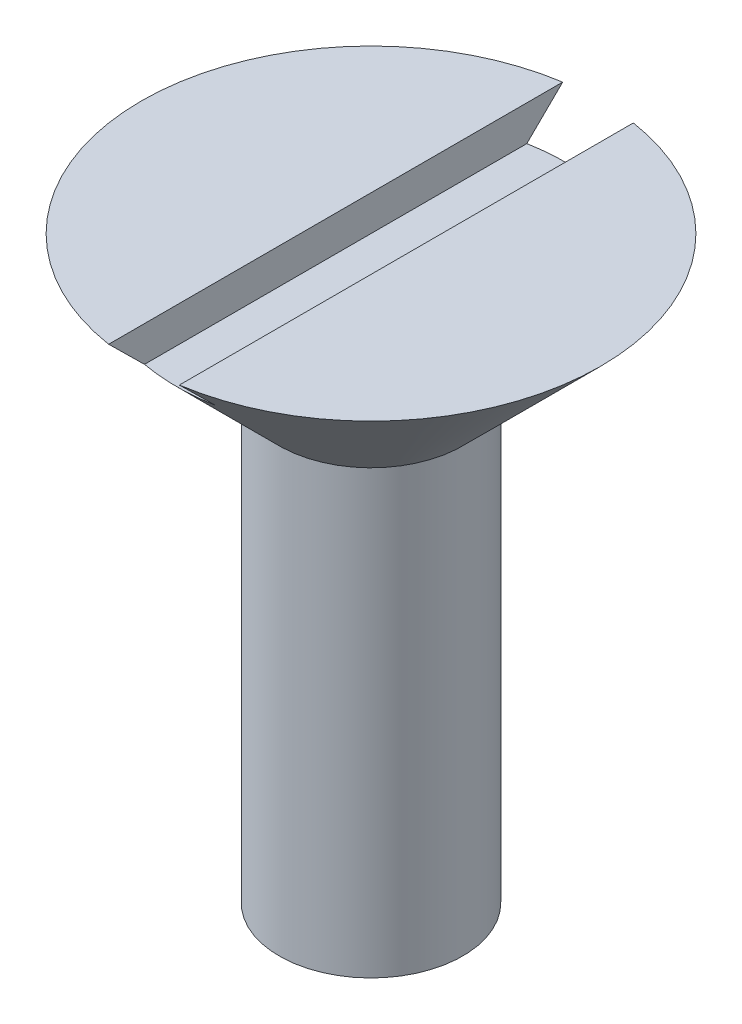
ISO-10303-21;
HEADER;
FILE_DESCRIPTION(('STEP AP214'),'2;1');
FILE_NAME('part.step','',(''),(''),'','','');
FILE_SCHEMA(('AUTOMOTIVE_DESIGN { 1 0 10303 214 1 1 1 1 }'));
ENDSEC;
DATA;
#1=APPLICATION_CONTEXT('core data for automotive mechanical design processes');
#2=APPLICATION_PROTOCOL_DEFINITION('international standard','automotive_design',2000,#1);
#3=PRODUCT_CONTEXT('',#1,'mechanical');
#4=PRODUCT('Part','Part','',(#3));
#5=PRODUCT_RELATED_PRODUCT_CATEGORY('part','',(#4));
#6=PRODUCT_DEFINITION_FORMATION('','',#4);
#7=PRODUCT_DEFINITION_CONTEXT('part definition',#1,'design');
#8=PRODUCT_DEFINITION('design','',#6,#7);
#9=PRODUCT_DEFINITION_SHAPE('','',#8);
#10=(LENGTH_UNIT() NAMED_UNIT(*) SI_UNIT(.MILLI.,.METRE.));
#11=(NAMED_UNIT(*) PLANE_ANGLE_UNIT() SI_UNIT($,.RADIAN.));
#12=(NAMED_UNIT(*) SI_UNIT($,.STERADIAN.) SOLID_ANGLE_UNIT());
#13=UNCERTAINTY_MEASURE_WITH_UNIT(LENGTH_MEASURE(1.E-05),#10,'distance_accuracy_value','');
#14=(GEOMETRIC_REPRESENTATION_CONTEXT(3) GLOBAL_UNCERTAINTY_ASSIGNED_CONTEXT((#13)) GLOBAL_UNIT_ASSIGNED_CONTEXT((#10,
#11,#12)) REPRESENTATION_CONTEXT('',''));
#15=CARTESIAN_POINT('',(0.,0.,0.));
#16=DIRECTION('',(0.,0.,1.));
#17=DIRECTION('',(1.,0.,0.));
#18=AXIS2_PLACEMENT_3D('',#15,#16,#17);
#19=CARTESIAN_POINT('',(0.,49.5556273934167,0.));
#20=DIRECTION('',(0.,-1.,0.));
#21=DIRECTION('',(1.,0.,0.));
#22=AXIS2_PLACEMENT_3D('',#19,#20,#21);
#23=PLANE('',#22);
#24=CARTESIAN_POINT('',(0.,49.5556273934167,0.));
#25=DIRECTION('',(0.,1.,0.));
#26=DIRECTION('',(-1.,0.,0.));
#27=AXIS2_PLACEMENT_3D('',#24,#25,#26);
#28=CIRCLE('',#27,6.5);
#29=CARTESIAN_POINT('',(1.,49.5556273934167,6.42261628933256));
#30=VERTEX_POINT('',#29);
#31=CARTESIAN_POINT('',(1.,49.5556273934167,-6.42261628933256));
#32=VERTEX_POINT('',#31);
#33=EDGE_CURVE('E137',#30,#32,#28,.T.);
#34=ORIENTED_EDGE('',*,*,#33,.T.);
#35=DIRECTION('',(0.,0.,1.));
#36=VECTOR('',#35,1.);
#37=CARTESIAN_POINT('',(1.,49.5556273934167,0.));
#38=LINE('',#37,#36);
#39=EDGE_CURVE('E138',#32,#30,#38,.T.);
#40=ORIENTED_EDGE('',*,*,#39,.T.);
#41=EDGE_LOOP('',(#34,#40));
#42=FACE_BOUND('',#41,.T.);
#43=ADVANCED_FACE('F36',(#42),#23,.F.);
#44=CARTESIAN_POINT('',(0.,31.6530138632886,0.));
#45=DIRECTION('',(0.,1.,0.));
#46=DIRECTION('',(-1.,0.,0.));
#47=AXIS2_PLACEMENT_3D('',#44,#45,#46);
#48=CONICAL_SURFACE('',#47,0.,1.0471975511966);
#49=CARTESIAN_POINT('',(0.,33.1520716589028,0.));
#50=DIRECTION('',(0.,1.,0.));
#51=DIRECTION('',(-1.,0.,0.));
#52=AXIS2_PLACEMENT_3D('',#49,#50,#51);
#53=CIRCLE('',#52,2.59644426548604);
#54=CARTESIAN_POINT('',(-2.59644426548604,33.1520716589028,0.));
#55=VERTEX_POINT('',#54);
#56=EDGE_CURVE('E142',#55,#55,#53,.T.);
#57=ORIENTED_EDGE('',*,*,#56,.F.);
#58=EDGE_LOOP('',(#57));
#59=FACE_BOUND('',#58,.T.);
#60=CARTESIAN_POINT('',(0.,31.6530138632886,0.));
#61=VERTEX_POINT('',#60);
#62=VERTEX_LOOP('',#61);
#63=FACE_BOUND('',#62,.T.);
#64=ADVANCED_FACE('F38',(#59,#63),#48,.T.);
#65=CARTESIAN_POINT('',(0.,49.5556273934167,0.));
#66=DIRECTION('',(0.,1.,0.));
#67=DIRECTION('',(-1.,0.,0.));
#68=AXIS2_PLACEMENT_3D('',#65,#66,#67);
#69=CYLINDRICAL_SURFACE('',#68,2.59644426548604);
#70=CARTESIAN_POINT('',(0.,45.6520716589028,0.));
#71=DIRECTION('',(0.,1.,0.));
#72=DIRECTION('',(-1.,0.,0.));
#73=AXIS2_PLACEMENT_3D('',#70,#71,#72);
#74=CIRCLE('',#73,2.59644426548604);
#75=CARTESIAN_POINT('',(-2.59644426548604,45.6520716589028,0.));
#76=VERTEX_POINT('',#75);
#77=EDGE_CURVE('E140',#76,#76,#74,.T.);
#78=ORIENTED_EDGE('',*,*,#77,.F.);
#79=EDGE_LOOP('',(#78));
#80=FACE_BOUND('',#79,.T.);
#81=ORIENTED_EDGE('',*,*,#56,.T.);
#82=EDGE_LOOP('',(#81));
#83=FACE_BOUND('',#82,.T.);
#84=ADVANCED_FACE('F127',(#80,#83),#69,.T.);
#85=CARTESIAN_POINT('',(0.,45.6520716589028,0.));
#86=DIRECTION('',(0.,1.,0.));
#87=DIRECTION('',(-1.,0.,0.));
#88=AXIS2_PLACEMENT_3D('',#85,#86,#87);
#89=CONICAL_SURFACE('',#88,2.59644426548604,0.785398163397453);
#90=CARTESIAN_POINT('',(0.,48.5556273934167,0.));
#91=DIRECTION('',(0.,-1.,0.));
#92=DIRECTION('',(0.,0.,-1.));
#93=AXIS2_PLACEMENT_3D('',#90,#91,#92);
#94=CIRCLE('',#93,5.49999999999999);
#95=CARTESIAN_POINT('',(-0.999999999999998,48.5556273934167,-5.40832691319597));
#96=VERTEX_POINT('',#95);
#97=CARTESIAN_POINT('',(1.,48.5556273934167,-5.40832691319597));
#98=VERTEX_POINT('',#97);
#99=EDGE_CURVE('E11',#96,#98,#94,.T.);
#100=ORIENTED_EDGE('',*,*,#99,.T.);
#101=CARTESIAN_POINT('',(1.,49.5563273934167,6.42332472244709));
#102=CARTESIAN_POINT('',(1.,49.3718349006858,6.23660097945427));
#103=CARTESIAN_POINT('',(1.,49.1874301279146,6.04979042026791));
#104=CARTESIAN_POINT('',(1.,48.8187600631537,5.67580075194413));
#105=CARTESIAN_POINT('',(1.,48.6344949310945,5.48862148517339));
#106=CARTESIAN_POINT('',(1.,48.2641485086885,5.11174427199786));
#107=CARTESIAN_POINT('',(1.,48.0780711564097,4.92204245247591));
#108=CARTESIAN_POINT('',(1.,47.7065189230305,4.54228085926044));
#109=CARTESIAN_POINT('',(1.,47.5210437391687,4.35222138163066));
#110=CARTESIAN_POINT('',(1.,47.0759531665542,3.89448779308009));
#111=CARTESIAN_POINT('',(1.,46.8166694616344,3.62648996292628));
#112=CARTESIAN_POINT('',(1.,46.4293715104418,3.22235847326324));
#113=CARTESIAN_POINT('',(1.,46.3004018235296,3.08714155543481));
#114=CARTESIAN_POINT('',(1.,46.0434438871884,2.81583986260065));
#115=CARTESIAN_POINT('',(1.,45.9154554067091,2.67975530664799));
#116=CARTESIAN_POINT('',(1.,45.6620840688314,2.40750996464741));
#117=CARTESIAN_POINT('',(1.,45.5366880652963,2.27136147506032));
#118=CARTESIAN_POINT('',(1.,45.3502788400979,2.06549251852141));
#119=CARTESIAN_POINT('',(1.,45.2883941698288,1.99656195550246));
#120=CARTESIAN_POINT('',(1.,45.1654067461725,1.85800765522076));
#121=CARTESIAN_POINT('',(1.,45.1043039763926,1.78838393254484));
#122=CARTESIAN_POINT('',(1.,44.983402415004,1.64849944827689));
#123=CARTESIAN_POINT('',(1.,44.9235993684596,1.57824237330104));
#124=CARTESIAN_POINT('',(1.,44.8054778779732,1.43649465507042));
#125=CARTESIAN_POINT('',(1.,44.7471592916823,1.36500413120581));
#126=CARTESIAN_POINT('',(1.,44.6327842460895,1.22040224759312));
#127=CARTESIAN_POINT('',(1.,44.5767245586803,1.14729345020522));
#128=CARTESIAN_POINT('',(1.,44.4679587963823,0.998633654183092));
#129=CARTESIAN_POINT('',(1.,44.4152506931825,0.923084175167167));
#130=CARTESIAN_POINT('',(1.,44.3530410849349,0.826733268002377));
#131=CARTESIAN_POINT('',(1.,44.3409336736924,0.807613449628497));
#132=CARTESIAN_POINT('',(1.,44.3171073241212,0.769130032509396));
#133=CARTESIAN_POINT('',(1.,44.3053884360386,0.749766402676427));
#134=CARTESIAN_POINT('',(1.,44.270893262789,0.69127744385543));
#135=CARTESIAN_POINT('',(1.,44.248779752349,0.651756012110399));
#136=CARTESIAN_POINT('',(1.,44.2070600808765,0.571795836460213));
#137=CARTESIAN_POINT('',(1.,44.1874353422073,0.531366913059411));
#138=CARTESIAN_POINT('',(1.,44.1512488811089,0.449164527118057));
#139=CARTESIAN_POINT('',(1.,44.1346862302821,0.407391476629304));
#140=CARTESIAN_POINT('',(1.,44.1001533055177,0.306630339616176));
#141=CARTESIAN_POINT('',(1.,44.0839417200509,0.247006700383582));
#142=CARTESIAN_POINT('',(1.,44.0617986819237,0.125997310764446));
#143=CARTESIAN_POINT('',(1.,44.0558295565245,0.0646188656950215));
#144=CARTESIAN_POINT('',(1.,44.0554348747838,-0.0584045004398524));
#145=CARTESIAN_POINT('',(1.,44.0610514812623,-0.1200495772222));
#146=CARTESIAN_POINT('',(1.,44.0826368877384,-0.241594604406597));
#147=CARTESIAN_POINT('',(1.,44.0986408856868,-0.301487895031297));
#148=CARTESIAN_POINT('',(1.,44.1398728373406,-0.42325524859561));
#149=CARTESIAN_POINT('',(1.,44.1657360141788,-0.4849047615989));
#150=CARTESIAN_POINT('',(1.,44.22340682896,-0.605404375291109));
#151=CARTESIAN_POINT('',(1.,44.2552258620696,-0.664248833759941));
#152=CARTESIAN_POINT('',(1.,44.3230263337406,-0.780076722377074));
#153=CARTESIAN_POINT('',(1.,44.3590387558889,-0.837041711978607));
#154=CARTESIAN_POINT('',(1.,44.4150425992618,-0.92110865579865));
#155=CARTESIAN_POINT('',(1.,44.4340329861368,-0.948889451470567));
#156=CARTESIAN_POINT('',(1.,44.4725756988928,-1.00405791508456));
#157=CARTESIAN_POINT('',(1.,44.4921280085565,-1.03144559433807));
#158=CARTESIAN_POINT('',(1.,44.5551503567173,-1.11814350022169));
#159=CARTESIAN_POINT('',(1.,44.5995003816039,-1.17681365371054));
#160=CARTESIAN_POINT('',(1.,44.6897590246513,-1.2929461238686));
#161=CARTESIAN_POINT('',(1.,44.7356678835745,-1.35040825171832));
#162=CARTESIAN_POINT('',(1.,44.8751043376926,-1.52148386035262));
#163=CARTESIAN_POINT('',(1.,44.9703015644438,-1.63373305297759));
#164=CARTESIAN_POINT('',(1.,45.1633672636201,-1.85622604953626));
#165=CARTESIAN_POINT('',(1.,45.2612401172959,-1.96646600221256));
#166=CARTESIAN_POINT('',(1.,45.4585529588412,-2.18547633450576));
#167=CARTESIAN_POINT('',(1.,45.5579925005781,-2.29424711666669));
#168=CARTESIAN_POINT('',(1.,45.7575958934933,-2.51044729255318));
#169=CARTESIAN_POINT('',(1.,45.8577562199349,-2.61787995144487));
#170=CARTESIAN_POINT('',(1.,46.0588245132372,-2.83205668510773));
#171=CARTESIAN_POINT('',(1.,46.1597325319362,-2.93880071115716));
#172=CARTESIAN_POINT('',(1.,46.4630583377278,-3.25807348248428));
#173=CARTESIAN_POINT('',(1.,46.66626903229,-3.46984818145713));
#174=CARTESIAN_POINT('',(1.,47.0921786136603,-3.91117980862672));
#175=CARTESIAN_POINT('',(1.,47.3149902938673,-4.14062755160511));
#176=CARTESIAN_POINT('',(1.,47.7615623205888,-4.59874114188874));
#177=CARTESIAN_POINT('',(1.,47.9853229488197,-4.82740671438633));
#178=CARTESIAN_POINT('',(1.,48.4334388693308,-5.28420548161052));
#179=CARTESIAN_POINT('',(1.,48.6577942269807,-5.51233861215162));
#180=CARTESIAN_POINT('',(1.,49.1068353170085,-5.96812929258627));
#181=CARTESIAN_POINT('',(1.,49.3315209138295,-6.19578697599766));
#182=CARTESIAN_POINT('',(1.,49.5563273934167,-6.42332472244709));
#183=B_SPLINE_CURVE_WITH_KNOTS('',3,(#101,#102,#103,#104,#105,#106,#107,#108,#109,#110,#111,
#112,#113,#114,#115,#116,#117,#118,#119,#120,#121,#122,#123,#124,#125,#126,#127,#128,#129,#130,
#131,#132,#133,#134,#135,#136,#137,#138,#139,#140,#141,#142,#143,#144,#145,#146,#147,#148,#149,
#150,#151,#152,#153,#154,#155,#156,#157,#158,#159,#160,#161,#162,#163,#164,#165,#166,#167,#168,
#169,#170,#171,#172,#173,#174,#175,#176,#177,#178,#179,#180,#181,#182),.UNSPECIFIED.,.F.,.F.,(4,
2,2,2,2,2,2,2,2,2,2,2,2,2,2,2,2,2,2,2,2,2,2,2,2,2,2,2,2,2,2,2,2,2,2,2,2,2,2,2,4),(0.,
0.787482879091102,1.57545946982075,2.37264371237522,3.16933207457068,4.28800672997836,
4.84858456810999,5.40902607813937,5.96429483881583,6.24219393443101,6.52008719426129,
6.79686319025391,7.07361254470393,7.3499512636095,7.62612112424389,7.69400967717522,
7.76190697586417,7.89770861286129,8.0324279907232,8.16710645565276,8.35176568840783,
8.53574425942201,8.72039354672398,8.90567181282051,9.1057648961966,9.30624479924503,
9.50831322811276,9.60926230610502,9.71020847356947,9.930805917818,10.1514375897978,
10.5929016423222,11.0351379005565,11.4772504248661,11.9178874921873,12.3585554006098,
13.2390498022864,14.1985373102663,15.1583329960949,16.1182389566304,17.077823941592),.UNSPECIFIED.);
#184=EDGE_CURVE('E94',#98,#32,#183,.T.);
#185=ORIENTED_EDGE('',*,*,#184,.T.);
#186=ORIENTED_EDGE('',*,*,#33,.F.);
#187=CARTESIAN_POINT('',(1.,48.5556273934167,5.40832691319597));
#188=VERTEX_POINT('',#187);
#189=EDGE_CURVE('E96',#30,#188,#183,.T.);
#190=ORIENTED_EDGE('',*,*,#189,.T.);
#191=CARTESIAN_POINT('',(-0.999999999999998,48.5556273934167,5.40832691319597));
#192=VERTEX_POINT('',#191);
#193=EDGE_CURVE('E40',#188,#192,#94,.T.);
#194=ORIENTED_EDGE('',*,*,#193,.T.);
#195=CARTESIAN_POINT('',(-0.999999999999999,49.5563273934167,-6.42332472244709));
#196=CARTESIAN_POINT('',(-0.999999999999998,49.3718349006858,-6.23660097945426));
#197=CARTESIAN_POINT('',(-0.999999999999998,49.1874301279146,-6.0497904202679));
#198=CARTESIAN_POINT('',(-0.999999999999998,48.8187600631537,-5.67580075194413));
#199=CARTESIAN_POINT('',(-0.999999999999998,48.6344949310945,-5.48862148517338));
#200=CARTESIAN_POINT('',(-0.999999999999998,48.2641485086885,-5.11174427199785));
#201=CARTESIAN_POINT('',(-0.999999999999998,48.0780711564097,-4.9220424524759));
#202=CARTESIAN_POINT('',(-0.999999999999998,47.7065189230305,-4.54228085926042));
#203=CARTESIAN_POINT('',(-0.999999999999998,47.5210437391687,-4.35222138163065));
#204=CARTESIAN_POINT('',(-0.999999999999998,47.0759531665541,-3.89448779308008));
#205=CARTESIAN_POINT('',(-0.999999999999998,46.8166694616344,-3.62648996292627));
#206=CARTESIAN_POINT('',(-0.999999999999998,46.4293715104418,-3.22235847326323));
#207=CARTESIAN_POINT('',(-0.999999999999998,46.3004018235296,-3.0871415554348));
#208=CARTESIAN_POINT('',(-0.999999999999998,46.0434438871884,-2.81583986260065));
#209=CARTESIAN_POINT('',(-0.999999999999998,45.9154554067091,-2.67975530664799));
#210=CARTESIAN_POINT('',(-0.999999999999998,45.6620840688314,-2.40750996464741));
#211=CARTESIAN_POINT('',(-0.999999999999998,45.5366880652963,-2.27136147506031));
#212=CARTESIAN_POINT('',(-0.999999999999998,45.3502788400979,-2.06549251852141));
#213=CARTESIAN_POINT('',(-0.999999999999998,45.2883941698288,-1.99656195550245));
#214=CARTESIAN_POINT('',(-0.999999999999998,45.1654067461725,-1.85800765522076));
#215=CARTESIAN_POINT('',(-0.999999999999997,45.1043039763926,-1.78838393254484));
#216=CARTESIAN_POINT('',(-0.999999999999997,44.983402415004,-1.64849944827689));
#217=CARTESIAN_POINT('',(-0.999999999999997,44.9235993684596,-1.57824237330104));
#218=CARTESIAN_POINT('',(-0.999999999999997,44.8054778779732,-1.43649465507043));
#219=CARTESIAN_POINT('',(-0.999999999999997,44.7471592916823,-1.36500413120582));
#220=CARTESIAN_POINT('',(-0.999999999999997,44.6327842460895,-1.22040224759312));
#221=CARTESIAN_POINT('',(-0.999999999999997,44.5767245586802,-1.14729345020522));
#222=CARTESIAN_POINT('',(-0.999999999999997,44.4679587963823,-0.998633654183089));
#223=CARTESIAN_POINT('',(-0.999999999999997,44.4152506931825,-0.923084175167161));
#224=CARTESIAN_POINT('',(-0.999999999999997,44.3530410849349,-0.826733268002377));
#225=CARTESIAN_POINT('',(-0.999999999999997,44.3409336736924,-0.807613449628499));
#226=CARTESIAN_POINT('',(-0.999999999999997,44.3171073241212,-0.769130032509398));
#227=CARTESIAN_POINT('',(-0.999999999999997,44.3053884360386,-0.749766402676428));
#228=CARTESIAN_POINT('',(-0.999999999999997,44.270893262789,-0.69127744385543));
#229=CARTESIAN_POINT('',(-0.999999999999997,44.248779752349,-0.651756012110401));
#230=CARTESIAN_POINT('',(-0.999999999999997,44.2070600808765,-0.571795836460213));
#231=CARTESIAN_POINT('',(-0.999999999999997,44.1874353422073,-0.531366913059409));
#232=CARTESIAN_POINT('',(-0.999999999999997,44.1512488811089,-0.449164527118054));
#233=CARTESIAN_POINT('',(-0.999999999999997,44.1346862302821,-0.407391476629304));
#234=CARTESIAN_POINT('',(-0.999999999999997,44.1001533055177,-0.306630339616179));
#235=CARTESIAN_POINT('',(-0.999999999999997,44.0839417200509,-0.247006700383584));
#236=CARTESIAN_POINT('',(-0.999999999999997,44.0617986819237,-0.125997310764448));
#237=CARTESIAN_POINT('',(-0.999999999999997,44.0558295565245,-0.0646188656950232));
#238=CARTESIAN_POINT('',(-0.999999999999997,44.0554348747838,0.0584045004398504));
#239=CARTESIAN_POINT('',(-0.999999999999997,44.0610514812623,0.120049577222198));
#240=CARTESIAN_POINT('',(-0.999999999999997,44.0826368877384,0.241594604406594));
#241=CARTESIAN_POINT('',(-0.999999999999997,44.0986408856868,0.301487895031294));
#242=CARTESIAN_POINT('',(-0.999999999999997,44.1398728373406,0.423255248595607));
#243=CARTESIAN_POINT('',(-0.999999999999997,44.1657360141788,0.484904761598899));
#244=CARTESIAN_POINT('',(-0.999999999999997,44.22340682896,0.605404375291107));
#245=CARTESIAN_POINT('',(-0.999999999999997,44.2552258620696,0.664248833759936));
#246=CARTESIAN_POINT('',(-0.999999999999997,44.3230263337405,0.780076722377065));
#247=CARTESIAN_POINT('',(-0.999999999999997,44.3590387558889,0.837041711978595));
#248=CARTESIAN_POINT('',(-0.999999999999997,44.4150425992618,0.92110865579864));
#249=CARTESIAN_POINT('',(-0.999999999999997,44.4340329861368,0.948889451470559));
#250=CARTESIAN_POINT('',(-0.999999999999997,44.4725756988928,1.00405791508455));
#251=CARTESIAN_POINT('',(-0.999999999999997,44.4921280085565,1.03144559433806));
#252=CARTESIAN_POINT('',(-0.999999999999997,44.5551503567173,1.11814350022167));
#253=CARTESIAN_POINT('',(-0.999999999999997,44.5995003816039,1.17681365371052));
#254=CARTESIAN_POINT('',(-0.999999999999997,44.6897590246513,1.29294612386858));
#255=CARTESIAN_POINT('',(-0.999999999999997,44.7356678835745,1.3504082517183));
#256=CARTESIAN_POINT('',(-0.999999999999997,44.8751043376926,1.52148386035259));
#257=CARTESIAN_POINT('',(-0.999999999999998,44.9703015644438,1.63373305297757));
#258=CARTESIAN_POINT('',(-0.999999999999998,45.16336726362,1.85622604953623));
#259=CARTESIAN_POINT('',(-0.999999999999998,45.2612401172959,1.96646600221253));
#260=CARTESIAN_POINT('',(-0.999999999999998,45.4585529588412,2.18547633450572));
#261=CARTESIAN_POINT('',(-0.999999999999998,45.5579925005781,2.29424711666666));
#262=CARTESIAN_POINT('',(-0.999999999999998,45.7575958934932,2.51044729255315));
#263=CARTESIAN_POINT('',(-0.999999999999998,45.8577562199348,2.61787995144483));
#264=CARTESIAN_POINT('',(-0.999999999999998,46.0588245132372,2.83205668510768));
#265=CARTESIAN_POINT('',(-0.999999999999998,46.1597325319362,2.93880071115712));
#266=CARTESIAN_POINT('',(-0.999999999999998,46.4630583377278,3.25807348248424));
#267=CARTESIAN_POINT('',(-0.999999999999998,46.6662690322899,3.46984818145708));
#268=CARTESIAN_POINT('',(-0.999999999999998,47.0921786136603,3.91117980862668));
#269=CARTESIAN_POINT('',(-0.999999999999998,47.3149902938673,4.14062755160507));
#270=CARTESIAN_POINT('',(-0.999999999999998,47.7615623205888,4.59874114188871));
#271=CARTESIAN_POINT('',(-0.999999999999998,47.9853229488196,4.8274067143863));
#272=CARTESIAN_POINT('',(-0.999999999999998,48.4334388693308,5.2842054816105));
#273=CARTESIAN_POINT('',(-0.999999999999998,48.6577942269807,5.5123386121516));
#274=CARTESIAN_POINT('',(-0.999999999999998,49.1068353170085,5.96812929258626));
#275=CARTESIAN_POINT('',(-0.999999999999998,49.3315209138294,6.19578697599765));
#276=CARTESIAN_POINT('',(-0.999999999999999,49.5563273934167,6.42332472244709));
#277=B_SPLINE_CURVE_WITH_KNOTS('',3,(#195,#196,#197,#198,#199,#200,#201,#202,#203,#204,#205,
#206,#207,#208,#209,#210,#211,#212,#213,#214,#215,#216,#217,#218,#219,#220,#221,#222,#223,#224,
#225,#226,#227,#228,#229,#230,#231,#232,#233,#234,#235,#236,#237,#238,#239,#240,#241,#242,#243,
#244,#245,#246,#247,#248,#249,#250,#251,#252,#253,#254,#255,#256,#257,#258,#259,#260,#261,#262,
#263,#264,#265,#266,#267,#268,#269,#270,#271,#272,#273,#274,#275,#276),.UNSPECIFIED.,.F.,.F.,(4,
2,2,2,2,2,2,2,2,2,2,2,2,2,2,2,2,2,2,2,2,2,2,2,2,2,2,2,2,2,2,2,2,2,2,2,2,2,2,2,4),(0.,
0.787482879091104,1.57545946982077,2.37264371237523,3.1693320745707,4.28800672997837,
4.84858456811,5.40902607813938,5.96429483881584,6.24219393443102,6.52008719426129,
6.79686319025391,7.07361254470393,7.34995126360951,7.62612112424389,7.69400967717522,
7.76190697586418,7.89770861286129,8.0324279907232,8.16710645565276,8.35176568840783,
8.53574425942201,8.72039354672398,8.90567181282051,9.1057648961966,9.30624479924502,
9.50831322811274,9.60926230610501,9.71020847356945,9.93080591781798,10.1514375897978,
10.5929016423222,11.0351379005565,11.4772504248661,11.9178874921873,12.3585554006097,
13.2390498022863,14.1985373102662,15.1583329960949,16.1182389566303,17.077823941592),.UNSPECIFIED.);
#278=CARTESIAN_POINT('',(-0.999999999999999,49.5556273934167,6.42261628933256));
#279=VERTEX_POINT('',#278);
#280=EDGE_CURVE('E87',#192,#279,#277,.T.);
#281=ORIENTED_EDGE('',*,*,#280,.T.);
#282=CARTESIAN_POINT('',(-0.999999999999999,49.5556273934167,-6.42261628933256));
#283=VERTEX_POINT('',#282);
#284=EDGE_CURVE('E93',#283,#279,#28,.T.);
#285=ORIENTED_EDGE('',*,*,#284,.F.);
#286=EDGE_CURVE('E51',#283,#96,#277,.T.);
#287=ORIENTED_EDGE('',*,*,#286,.T.);
#288=EDGE_LOOP('',(#100,#185,#186,#190,#194,#281,#285,#287));
#289=FACE_BOUND('',#288,.T.);
#290=ORIENTED_EDGE('',*,*,#77,.T.);
#291=EDGE_LOOP('',(#290));
#292=FACE_BOUND('',#291,.T.);
#293=ADVANCED_FACE('F90',(#289,#292),#89,.T.);
#294=ORIENTED_EDGE('',*,*,#284,.T.);
#295=DIRECTION('',(0.,0.,-1.));
#296=VECTOR('',#295,1.);
#297=CARTESIAN_POINT('',(-0.999999999999999,49.5556273934167,0.));
#298=LINE('',#297,#296);
#299=EDGE_CURVE('E147',#279,#283,#298,.T.);
#300=ORIENTED_EDGE('',*,*,#299,.T.);
#301=EDGE_LOOP('',(#294,#300));
#302=FACE_BOUND('',#301,.T.);
#303=ADVANCED_FACE('F120',(#302),#23,.F.);
#304=CARTESIAN_POINT('',(-0.999999999999998,48.5556273934167,-10.));
#305=DIRECTION('',(0.,-1.,0.));
#306=DIRECTION('',(0.,0.,-1.));
#307=AXIS2_PLACEMENT_3D('',#304,#305,#306);
#308=PLANE('',#307);
#309=DIRECTION('',(0.,0.,1.));
#310=VECTOR('',#309,1.);
#311=CARTESIAN_POINT('',(1.,48.5556273934167,-10.));
#312=LINE('',#311,#310);
#313=EDGE_CURVE('E82',#98,#188,#312,.T.);
#314=ORIENTED_EDGE('',*,*,#313,.F.);
#315=ORIENTED_EDGE('',*,*,#99,.F.);
#316=DIRECTION('',(0.,0.,1.));
#317=VECTOR('',#316,1.);
#318=CARTESIAN_POINT('',(-0.999999999999998,48.5556273934167,-10.));
#319=LINE('',#318,#317);
#320=EDGE_CURVE('E79',#96,#192,#319,.T.);
#321=ORIENTED_EDGE('',*,*,#320,.T.);
#322=ORIENTED_EDGE('',*,*,#193,.F.);
#323=EDGE_LOOP('',(#314,#315,#321,#322));
#324=FACE_BOUND('',#323,.T.);
#325=ADVANCED_FACE('F78',(#324),#308,.F.);
#326=CARTESIAN_POINT('',(1.,50.5556273934167,-10.));
#327=DIRECTION('',(1.,0.,0.));
#328=DIRECTION('',(0.,1.,0.));
#329=AXIS2_PLACEMENT_3D('',#326,#327,#328);
#330=PLANE('',#329);
#331=ORIENTED_EDGE('',*,*,#39,.F.);
#332=ORIENTED_EDGE('',*,*,#184,.F.);
#333=ORIENTED_EDGE('',*,*,#313,.T.);
#334=ORIENTED_EDGE('',*,*,#189,.F.);
#335=EDGE_LOOP('',(#331,#332,#333,#334));
#336=FACE_BOUND('',#335,.T.);
#337=ADVANCED_FACE('F116',(#336),#330,.F.);
#338=CARTESIAN_POINT('',(-0.999999999999999,50.5556273934167,-10.));
#339=DIRECTION('',(-1.,0.,0.));
#340=DIRECTION('',(0.,-1.,0.));
#341=AXIS2_PLACEMENT_3D('',#338,#339,#340);
#342=PLANE('',#341);
#343=ORIENTED_EDGE('',*,*,#299,.F.);
#344=ORIENTED_EDGE('',*,*,#280,.F.);
#345=ORIENTED_EDGE('',*,*,#320,.F.);
#346=ORIENTED_EDGE('',*,*,#286,.F.);
#347=EDGE_LOOP('',(#343,#344,#345,#346));
#348=FACE_BOUND('',#347,.T.);
#349=ADVANCED_FACE('F85',(#348),#342,.F.);
#350=CLOSED_SHELL('',(#43,#64,#84,#293,#303,#325,#337,#349));
#351=MANIFOLD_SOLID_BREP('B2',#350);
#352=ADVANCED_BREP_SHAPE_REPRESENTATION('',(#18,#351),#14);
#353=SHAPE_DEFINITION_REPRESENTATION(#9,#352);
ENDSEC;
END-ISO-10303-21;
